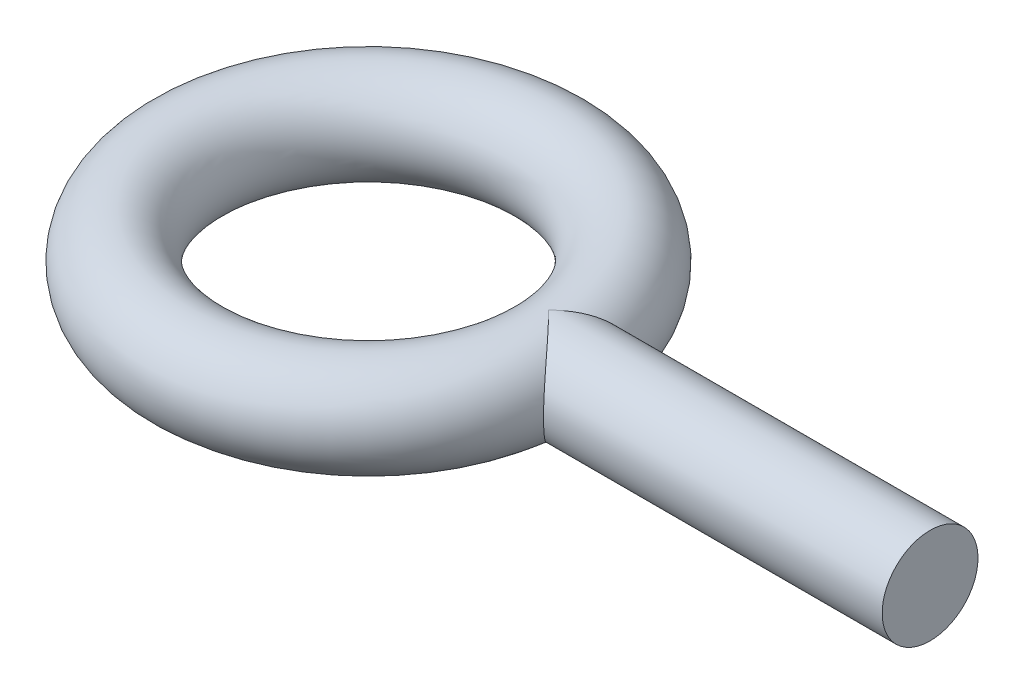
ISO-10303-21;
HEADER;
FILE_DESCRIPTION(('STEP AP214'),'2;1');
FILE_NAME('part.step','',(''),(''),'','','');
FILE_SCHEMA(('AUTOMOTIVE_DESIGN { 1 0 10303 214 1 1 1 1 }'));
ENDSEC;
DATA;
#1=APPLICATION_CONTEXT('core data for automotive mechanical design processes');
#2=APPLICATION_PROTOCOL_DEFINITION('international standard','automotive_design',2000,#1);
#3=PRODUCT_CONTEXT('',#1,'mechanical');
#4=PRODUCT('Part','Part','',(#3));
#5=PRODUCT_RELATED_PRODUCT_CATEGORY('part','',(#4));
#6=PRODUCT_DEFINITION_FORMATION('','',#4);
#7=PRODUCT_DEFINITION_CONTEXT('part definition',#1,'design');
#8=PRODUCT_DEFINITION('design','',#6,#7);
#9=PRODUCT_DEFINITION_SHAPE('','',#8);
#10=(LENGTH_UNIT() NAMED_UNIT(*) SI_UNIT(.MILLI.,.METRE.));
#11=(NAMED_UNIT(*) PLANE_ANGLE_UNIT() SI_UNIT($,.RADIAN.));
#12=(NAMED_UNIT(*) SI_UNIT($,.STERADIAN.) SOLID_ANGLE_UNIT());
#13=UNCERTAINTY_MEASURE_WITH_UNIT(LENGTH_MEASURE(1.E-05),#10,'distance_accuracy_value','');
#14=(GEOMETRIC_REPRESENTATION_CONTEXT(3) GLOBAL_UNCERTAINTY_ASSIGNED_CONTEXT((#13)) GLOBAL_UNIT_ASSIGNED_CONTEXT((#10,
#11,#12)) REPRESENTATION_CONTEXT('',''));
#15=CARTESIAN_POINT('',(0.,0.,0.));
#16=DIRECTION('',(0.,0.,1.));
#17=DIRECTION('',(1.,0.,0.));
#18=AXIS2_PLACEMENT_3D('',#15,#16,#17);
#19=CARTESIAN_POINT('',(37.211,0.,0.));
#20=DIRECTION('',(1.,0.,0.));
#21=DIRECTION('',(0.,0.,-1.));
#22=AXIS2_PLACEMENT_3D('',#19,#20,#21);
#23=PLANE('',#22);
#24=CARTESIAN_POINT('',(37.211,0.,0.));
#25=DIRECTION('',(1.,0.,0.));
#26=DIRECTION('',(0.,0.,-1.));
#27=AXIS2_PLACEMENT_3D('',#24,#25,#26);
#28=CIRCLE('',#27,3.175);
#29=CARTESIAN_POINT('',(37.211,0.,-3.175));
#30=VERTEX_POINT('',#29);
#31=EDGE_CURVE('E11',#30,#30,#28,.T.);
#32=ORIENTED_EDGE('',*,*,#31,.T.);
#33=EDGE_LOOP('',(#32));
#34=FACE_BOUND('',#33,.T.);
#35=ADVANCED_FACE('F32',(#34),#23,.T.);
#36=CARTESIAN_POINT('',(-500000.,0.,0.));
#37=DIRECTION('',(1.,0.,0.));
#38=DIRECTION('',(0.,0.,-1.));
#39=AXIS2_PLACEMENT_3D('',#36,#37,#38);
#40=CYLINDRICAL_SURFACE('',#39,3.175);
#41=ORIENTED_EDGE('',*,*,#31,.F.);
#42=EDGE_LOOP('',(#41));
#43=FACE_BOUND('',#42,.T.);
#44=CARTESIAN_POINT('',(11.9380000001137,-3.175,0.));
#45=CARTESIAN_POINT('',(11.9406561834803,-3.17499999688607,-0.0026561779801846));
#46=CARTESIAN_POINT('',(11.9433119715631,-3.17499666375708,-0.00531285274656176));
#47=CARTESIAN_POINT('',(12.135052718968,-3.17451524384718,-0.197181950440996));
#48=CARTESIAN_POINT('',(12.322108785478,-3.15713518837523,-0.388881585641265));
#49=CARTESIAN_POINT('',(12.6889286418311,-3.08563804056821,-0.773135021425681));
#50=CARTESIAN_POINT('',(12.8686790533259,-3.03145650858393,-0.965689730727639));
#51=CARTESIAN_POINT('',(13.1972415224908,-2.89115679569068,-1.32465345425178));
#52=CARTESIAN_POINT('',(13.347267894283,-2.80927608311133,-1.49158270520288));
#53=CARTESIAN_POINT('',(13.6343563501206,-2.61126456990642,-1.81602054744563));
#54=CARTESIAN_POINT('',(13.7714377685268,-2.49518595037007,-1.97354305484003));
#55=CARTESIAN_POINT('',(14.0000403307332,-2.2559109501608,-2.23970221369559));
#56=CARTESIAN_POINT('',(14.0950172512358,-2.13962377981355,-2.35156349141587));
#57=CARTESIAN_POINT('',(14.2707043273275,-1.88482703541485,-2.56028909367378));
#58=CARTESIAN_POINT('',(14.3514305313341,-1.74634279837484,-2.65717027255805));
#59=CARTESIAN_POINT('',(14.4827521353501,-1.47384984242152,-2.81582722042483));
#60=CARTESIAN_POINT('',(14.5361337972912,-1.34303670220555,-2.88076859535968));
#61=CARTESIAN_POINT('',(14.6281801430016,-1.06921794823319,-2.99320174327468));
#62=CARTESIAN_POINT('',(14.6668515613707,-0.926217950620094,-3.04070150097738));
#63=CARTESIAN_POINT('',(14.7275888850702,-0.630698274793122,-3.11547526569956));
#64=CARTESIAN_POINT('',(14.7495630785356,-0.478130932239308,-3.14263755454466));
#65=CARTESIAN_POINT('',(14.7751575890607,-0.169148987242148,-3.17428643834667));
#66=CARTESIAN_POINT('',(14.7787853440113,-0.0127359697343463,-3.17878222260445));
#67=CARTESIAN_POINT('',(14.768017044085,0.283528691830885,-3.16545785207772));
#68=CARTESIAN_POINT('',(14.7552989161042,0.423543247816293,-3.14971516285176));
#69=CARTESIAN_POINT('',(14.7153581313136,0.698224876244867,-3.10041573788164));
#70=CARTESIAN_POINT('',(14.6881354918075,0.83289195506737,-3.06685902338963));
#71=CARTESIAN_POINT('',(14.6200758678568,1.0952952538976,-2.98331431358416));
#72=CARTESIAN_POINT('',(14.5790725170573,1.22292344547891,-2.93312563935445));
#73=CARTESIAN_POINT('',(14.4852636776854,1.46711957878263,-2.81893212654111));
#74=CARTESIAN_POINT('',(14.4324545812635,1.58368412389589,-2.75492306463579));
#75=CARTESIAN_POINT('',(14.3094123208378,1.81852740859861,-2.60676830029952));
#76=CARTESIAN_POINT('',(14.2378148202942,1.93512093985339,-2.52109452417199));
#77=CARTESIAN_POINT('',(14.084242017774,2.15177711182023,-2.33892238633109));
#78=CARTESIAN_POINT('',(14.0022594176395,2.25182801204699,-2.24241641775068));
#79=CARTESIAN_POINT('',(13.7855458679265,2.48269688009893,-1.9898009680834));
#80=CARTESIAN_POINT('',(13.6453779585823,2.60285902020261,-1.82857214073235));
#81=CARTESIAN_POINT('',(13.3512889922185,2.80726912600443,-1.49603520488295));
#82=CARTESIAN_POINT('',(13.1973369250763,2.89143352131588,-1.32470468191056));
#83=CARTESIAN_POINT('',(12.8651896897388,3.03259103986768,-0.961936806893972));
#84=CARTESIAN_POINT('',(12.6860697190923,3.08634634692597,-0.770106698778968));
#85=CARTESIAN_POINT('',(12.3206168237436,3.15727345438414,-0.387352582527563));
#86=CARTESIAN_POINT('',(12.1342988081117,3.17451713590145,-0.196427533764145));
#87=CARTESIAN_POINT('',(11.943311971619,3.17499666376898,-0.00531285281891122));
#88=CARTESIAN_POINT('',(11.9406561835345,3.17499999689865,-0.0026561780509117));
#89=CARTESIAN_POINT('',(11.9380000001137,3.175,0.));
#90=B_SPLINE_CURVE_WITH_KNOTS('',3,(#44,#45,#46,#47,#48,#49,#50,#51,#52,#53,#54,#55,#56,#57,#58,
#59,#60,#61,#62,#63,#64,#65,#66,#67,#68,#69,#70,#71,#72,#73,#74,#75,#76,#77,#78,#79,#80,#81,#82,
#83,#84,#85,#86,#87,#88,#89),.UNSPECIFIED.,.F.,.F.,(4,2,2,2,2,2,2,2,2,2,2,2,2,2,2,2,2,2,2,2,2,2,
4),(0.,0.0112694322662178,0.813745285712918,1.6176299148947,2.33182783799981,3.04494159259545,
3.60457144790596,4.16356699989599,4.6281359840988,5.09249202400662,5.55938052737419,
6.02607973273545,6.44848544294282,6.87089064922117,7.29859031056248,7.72642085652801,
8.20893503754328,8.6917902077249,9.42308095287485,10.156060326877,10.956914737693,
11.7561910199207,11.7674604521869),.UNSPECIFIED.);
#91=CARTESIAN_POINT('',(11.9380000001137,-3.175,0.));
#92=VERTEX_POINT('',#91);
#93=CARTESIAN_POINT('',(11.9380000001137,3.17500000000004,0.));
#94=VERTEX_POINT('',#93);
#95=EDGE_CURVE('E45',#92,#94,#90,.T.);
#96=ORIENTED_EDGE('',*,*,#95,.T.);
#97=CARTESIAN_POINT('',(11.9380000001137,3.175,0.));
#98=CARTESIAN_POINT('',(11.9406561834803,3.17499999688607,0.0026561779801846));
#99=CARTESIAN_POINT('',(11.9433119715631,3.17499666375708,0.00531285274656176));
#100=CARTESIAN_POINT('',(12.135052718968,3.17451524384718,0.197181950440996));
#101=CARTESIAN_POINT('',(12.322108785478,3.15713518837523,0.388881585641265));
#102=CARTESIAN_POINT('',(12.6889286418311,3.08563804056821,0.773135021425681));
#103=CARTESIAN_POINT('',(12.8686790533259,3.03145650858393,0.965689730727639));
#104=CARTESIAN_POINT('',(13.1972415224908,2.89115679569068,1.32465345425178));
#105=CARTESIAN_POINT('',(13.347267894283,2.80927608311133,1.49158270520288));
#106=CARTESIAN_POINT('',(13.6343563501206,2.61126456990642,1.81602054744563));
#107=CARTESIAN_POINT('',(13.7714377685268,2.49518595037007,1.97354305484003));
#108=CARTESIAN_POINT('',(14.0000403307332,2.2559109501608,2.23970221369559));
#109=CARTESIAN_POINT('',(14.0950172512358,2.13962377981355,2.35156349141587));
#110=CARTESIAN_POINT('',(14.2707043273275,1.88482703541485,2.56028909367378));
#111=CARTESIAN_POINT('',(14.3514305313341,1.74634279837484,2.65717027255805));
#112=CARTESIAN_POINT('',(14.4827521353501,1.47384984242152,2.81582722042483));
#113=CARTESIAN_POINT('',(14.5361337972912,1.34303670220555,2.88076859535968));
#114=CARTESIAN_POINT('',(14.6281801430016,1.06921794823319,2.99320174327468));
#115=CARTESIAN_POINT('',(14.6668515613707,0.926217950620094,3.04070150097738));
#116=CARTESIAN_POINT('',(14.7275888850702,0.630698274793122,3.11547526569956));
#117=CARTESIAN_POINT('',(14.7495630785356,0.478130932239308,3.14263755454466));
#118=CARTESIAN_POINT('',(14.7751575890607,0.169148987242148,3.17428643834667));
#119=CARTESIAN_POINT('',(14.7787853440113,0.0127359697343463,3.17878222260445));
#120=CARTESIAN_POINT('',(14.768017044085,-0.283528691830885,3.16545785207772));
#121=CARTESIAN_POINT('',(14.7552989161042,-0.423543247816293,3.14971516285176));
#122=CARTESIAN_POINT('',(14.7153581313136,-0.698224876244867,3.10041573788164));
#123=CARTESIAN_POINT('',(14.6881354918075,-0.83289195506737,3.06685902338963));
#124=CARTESIAN_POINT('',(14.6200758678568,-1.0952952538976,2.98331431358416));
#125=CARTESIAN_POINT('',(14.5790725170573,-1.22292344547891,2.93312563935445));
#126=CARTESIAN_POINT('',(14.4852636776854,-1.46711957878263,2.81893212654111));
#127=CARTESIAN_POINT('',(14.4324545812635,-1.58368412389589,2.75492306463579));
#128=CARTESIAN_POINT('',(14.3094123208378,-1.81852740859861,2.60676830029952));
#129=CARTESIAN_POINT('',(14.2378148202942,-1.93512093985339,2.52109452417199));
#130=CARTESIAN_POINT('',(14.084242017774,-2.15177711182023,2.33892238633109));
#131=CARTESIAN_POINT('',(14.0022594176395,-2.25182801204699,2.24241641775068));
#132=CARTESIAN_POINT('',(13.7855458679265,-2.48269688009893,1.9898009680834));
#133=CARTESIAN_POINT('',(13.6453779585823,-2.60285902020261,1.82857214073235));
#134=CARTESIAN_POINT('',(13.3512889922185,-2.80726912600443,1.49603520488295));
#135=CARTESIAN_POINT('',(13.1973369250763,-2.89143352131588,1.32470468191056));
#136=CARTESIAN_POINT('',(12.8651896897388,-3.03259103986768,0.961936806893972));
#137=CARTESIAN_POINT('',(12.6860697190923,-3.08634634692597,0.770106698778968));
#138=CARTESIAN_POINT('',(12.3206168237436,-3.15727345438414,0.387352582527563));
#139=CARTESIAN_POINT('',(12.1342988081117,-3.17451713590145,0.196427533764145));
#140=CARTESIAN_POINT('',(11.943311971619,-3.17499666376898,0.00531285281891122));
#141=CARTESIAN_POINT('',(11.9406561835345,-3.17499999689865,0.0026561780509117));
#142=CARTESIAN_POINT('',(11.9380000001137,-3.175,0.));
#143=B_SPLINE_CURVE_WITH_KNOTS('',3,(#97,#98,#99,#100,#101,#102,#103,#104,#105,#106,#107,#108,
#109,#110,#111,#112,#113,#114,#115,#116,#117,#118,#119,#120,#121,#122,#123,#124,#125,#126,#127,
#128,#129,#130,#131,#132,#133,#134,#135,#136,#137,#138,#139,#140,#141,#142),.UNSPECIFIED.,.F.,
.F.,(4,2,2,2,2,2,2,2,2,2,2,2,2,2,2,2,2,2,2,2,2,2,4),(0.,0.0112694322662178,0.813745285712918,
1.6176299148947,2.33182783799981,3.04494159259545,3.60457144790596,4.16356699989599,
4.6281359840988,5.09249202400662,5.55938052737419,6.02607973273545,6.44848544294282,
6.87089064922117,7.29859031056248,7.72642085652801,8.20893503754328,8.6917902077249,
9.42308095287485,10.156060326877,10.956914737693,11.7561910199207,11.7674604521869),.UNSPECIFIED.);
#144=EDGE_CURVE('E36',#94,#92,#143,.T.);
#145=ORIENTED_EDGE('',*,*,#144,.T.);
#146=EDGE_LOOP('',(#96,#145));
#147=FACE_BOUND('',#146,.T.);
#148=ADVANCED_FACE('F53',(#43,#147),#40,.T.);
#149=CARTESIAN_POINT('',(0.,0.,0.));
#150=DIRECTION('',(0.,-1.,0.));
#151=DIRECTION('',(0.,0.,-1.));
#152=AXIS2_PLACEMENT_3D('',#149,#150,#151);
#153=TOROIDAL_SURFACE('',#152,11.938,3.175);
#154=ORIENTED_EDGE('',*,*,#144,.F.);
#155=ORIENTED_EDGE('',*,*,#95,.F.);
#156=EDGE_LOOP('',(#154,#155));
#157=FACE_BOUND('',#156,.T.);
#158=ADVANCED_FACE('F34',(#157),#153,.T.);
#159=CLOSED_SHELL('',(#35,#148,#158));
#160=MANIFOLD_SOLID_BREP('B2',#159);
#161=ADVANCED_BREP_SHAPE_REPRESENTATION('',(#18,#160),#14);
#162=SHAPE_DEFINITION_REPRESENTATION(#9,#161);
ENDSEC;
END-ISO-10303-21;
